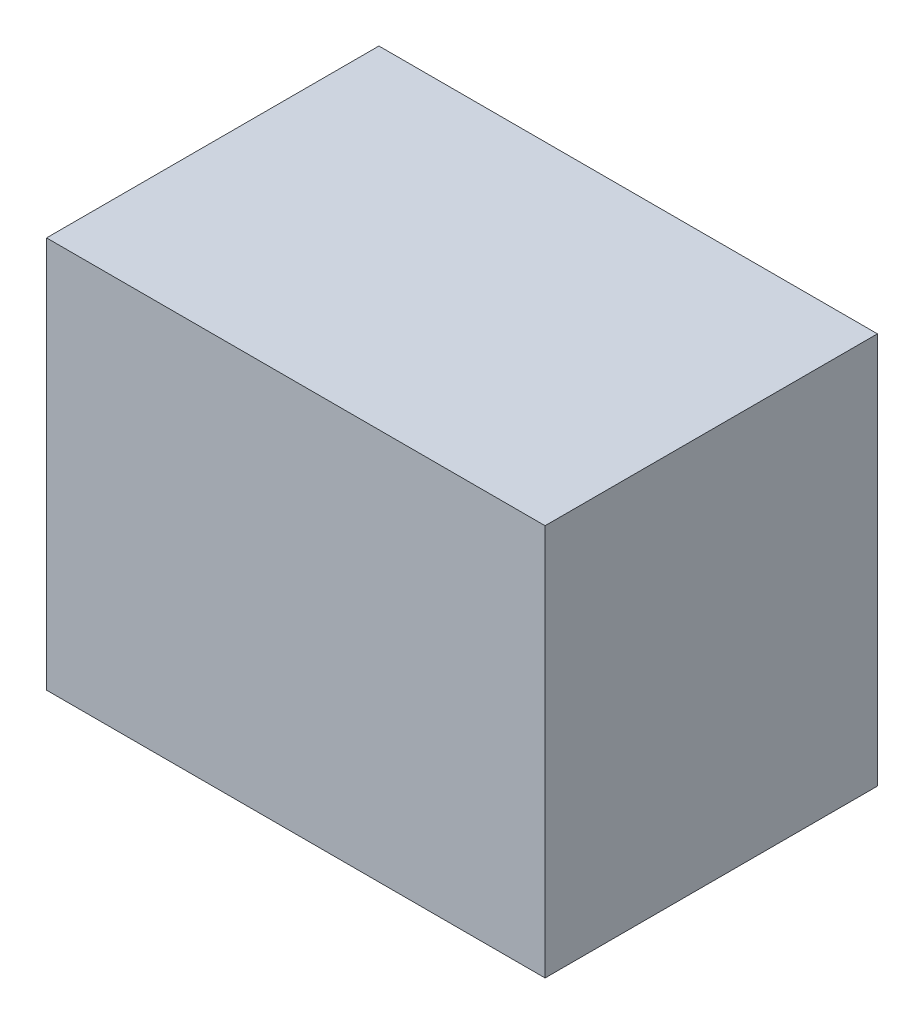
ISO-10303-21;
HEADER;
FILE_DESCRIPTION(('STEP AP214'),'2;1');
FILE_NAME('part.step','',(''),(''),'','','');
FILE_SCHEMA(('AUTOMOTIVE_DESIGN { 1 0 10303 214 1 1 1 1 }'));
ENDSEC;
DATA;
#1=APPLICATION_CONTEXT('core data for automotive mechanical design processes');
#2=APPLICATION_PROTOCOL_DEFINITION('international standard','automotive_design',2000,#1);
#3=PRODUCT_CONTEXT('',#1,'mechanical');
#4=PRODUCT('Part','Part','',(#3));
#5=PRODUCT_RELATED_PRODUCT_CATEGORY('part','',(#4));
#6=PRODUCT_DEFINITION_FORMATION('','',#4);
#7=PRODUCT_DEFINITION_CONTEXT('part definition',#1,'design');
#8=PRODUCT_DEFINITION('design','',#6,#7);
#9=PRODUCT_DEFINITION_SHAPE('','',#8);
#10=(LENGTH_UNIT() NAMED_UNIT(*) SI_UNIT(.MILLI.,.METRE.));
#11=(NAMED_UNIT(*) PLANE_ANGLE_UNIT() SI_UNIT($,.RADIAN.));
#12=(NAMED_UNIT(*) SI_UNIT($,.STERADIAN.) SOLID_ANGLE_UNIT());
#13=UNCERTAINTY_MEASURE_WITH_UNIT(LENGTH_MEASURE(1.E-05),#10,'distance_accuracy_value','');
#14=(GEOMETRIC_REPRESENTATION_CONTEXT(3) GLOBAL_UNCERTAINTY_ASSIGNED_CONTEXT((#13)) GLOBAL_UNIT_ASSIGNED_CONTEXT((#10,
#11,#12)) REPRESENTATION_CONTEXT('',''));
#15=CARTESIAN_POINT('',(0.,0.,0.));
#16=DIRECTION('',(0.,0.,1.));
#17=DIRECTION('',(1.,0.,0.));
#18=AXIS2_PLACEMENT_3D('',#15,#16,#17);
#19=CARTESIAN_POINT('',(2.10000088,1.65000178,2.8));
#20=DIRECTION('',(0.,0.,-1.));
#21=DIRECTION('',(-1.,0.,0.));
#22=AXIS2_PLACEMENT_3D('',#19,#20,#21);
#23=PLANE('',#22);
#24=DIRECTION('',(0.,1.,0.));
#25=VECTOR('',#24,1.);
#26=CARTESIAN_POINT('',(-2.10000088,1.65000178,2.8));
#27=LINE('',#26,#25);
#28=CARTESIAN_POINT('',(-2.10000088,1.65000178,2.8));
#29=VERTEX_POINT('',#28);
#30=CARTESIAN_POINT('',(-2.10000088,-1.64999924,2.8));
#31=VERTEX_POINT('',#30);
#32=EDGE_CURVE('E79',#29,#31,#27,.F.);
#33=ORIENTED_EDGE('',*,*,#32,.T.);
#34=DIRECTION('',(1.,0.,0.));
#35=VECTOR('',#34,1.);
#36=CARTESIAN_POINT('',(-2.10000088,-1.64999924,2.8));
#37=LINE('',#36,#35);
#38=CARTESIAN_POINT('',(2.10000088,-1.64999924,2.8));
#39=VERTEX_POINT('',#38);
#40=EDGE_CURVE('E55',#31,#39,#37,.T.);
#41=ORIENTED_EDGE('',*,*,#40,.T.);
#42=DIRECTION('',(0.,1.,0.));
#43=VECTOR('',#42,1.);
#44=CARTESIAN_POINT('',(2.10000088,-1.64999924,2.8));
#45=LINE('',#44,#43);
#46=CARTESIAN_POINT('',(2.10000088,1.65000178,2.8));
#47=VERTEX_POINT('',#46);
#48=EDGE_CURVE('E57',#39,#47,#45,.T.);
#49=ORIENTED_EDGE('',*,*,#48,.T.);
#50=DIRECTION('',(1.,0.,0.));
#51=VECTOR('',#50,1.);
#52=CARTESIAN_POINT('',(2.10000088,1.65000178,2.8));
#53=LINE('',#52,#51);
#54=EDGE_CURVE('E20',#47,#29,#53,.F.);
#55=ORIENTED_EDGE('',*,*,#54,.T.);
#56=EDGE_LOOP('',(#33,#41,#49,#55));
#57=FACE_BOUND('',#56,.T.);
#58=ADVANCED_FACE('F17',(#57),#23,.F.);
#59=CARTESIAN_POINT('',(2.10000088,1.65000178,0.));
#60=DIRECTION('',(0.,-1.,0.));
#61=DIRECTION('',(0.,0.,-1.));
#62=AXIS2_PLACEMENT_3D('',#59,#60,#61);
#63=PLANE('',#62);
#64=DIRECTION('',(-1.,0.,0.));
#65=VECTOR('',#64,1.);
#66=CARTESIAN_POINT('',(2.10000088,1.65000178,0.));
#67=LINE('',#66,#65);
#68=CARTESIAN_POINT('',(-2.10000088,1.65000178,0.));
#69=VERTEX_POINT('',#68);
#70=CARTESIAN_POINT('',(2.10000088,1.65000178,0.));
#71=VERTEX_POINT('',#70);
#72=EDGE_CURVE('E83',#69,#71,#67,.F.);
#73=ORIENTED_EDGE('',*,*,#72,.F.);
#74=DIRECTION('',(0.,0.,-1.));
#75=VECTOR('',#74,1.);
#76=CARTESIAN_POINT('',(-2.10000088,1.65000178,0.));
#77=LINE('',#76,#75);
#78=EDGE_CURVE('E68',#69,#29,#77,.F.);
#79=ORIENTED_EDGE('',*,*,#78,.T.);
#80=ORIENTED_EDGE('',*,*,#54,.F.);
#81=DIRECTION('',(0.,0.,1.));
#82=VECTOR('',#81,1.);
#83=CARTESIAN_POINT('',(2.10000088,1.65000178,0.));
#84=LINE('',#83,#82);
#85=EDGE_CURVE('E63',#47,#71,#84,.F.);
#86=ORIENTED_EDGE('',*,*,#85,.T.);
#87=EDGE_LOOP('',(#73,#79,#80,#86));
#88=FACE_BOUND('',#87,.T.);
#89=ADVANCED_FACE('F65',(#88),#63,.F.);
#90=CARTESIAN_POINT('',(2.10000088,-1.64999924,0.));
#91=DIRECTION('',(-1.,0.,0.));
#92=DIRECTION('',(0.,0.,1.));
#93=AXIS2_PLACEMENT_3D('',#90,#91,#92);
#94=PLANE('',#93);
#95=DIRECTION('',(0.,1.,0.));
#96=VECTOR('',#95,1.);
#97=CARTESIAN_POINT('',(2.10000088,1.65000178,0.));
#98=LINE('',#97,#96);
#99=CARTESIAN_POINT('',(2.10000088,-1.64999924,0.));
#100=VERTEX_POINT('',#99);
#101=EDGE_CURVE('E72',#71,#100,#98,.F.);
#102=ORIENTED_EDGE('',*,*,#101,.F.);
#103=ORIENTED_EDGE('',*,*,#85,.F.);
#104=ORIENTED_EDGE('',*,*,#48,.F.);
#105=DIRECTION('',(0.,0.,1.));
#106=VECTOR('',#105,1.);
#107=CARTESIAN_POINT('',(2.10000088,-1.64999924,0.));
#108=LINE('',#107,#106);
#109=EDGE_CURVE('E75',#39,#100,#108,.F.);
#110=ORIENTED_EDGE('',*,*,#109,.T.);
#111=EDGE_LOOP('',(#102,#103,#104,#110));
#112=FACE_BOUND('',#111,.T.);
#113=ADVANCED_FACE('F70',(#112),#94,.F.);
#114=CARTESIAN_POINT('',(-2.10000088,-1.64999924,0.));
#115=DIRECTION('',(0.,1.,0.));
#116=DIRECTION('',(0.,0.,1.));
#117=AXIS2_PLACEMENT_3D('',#114,#115,#116);
#118=PLANE('',#117);
#119=DIRECTION('',(-1.,0.,0.));
#120=VECTOR('',#119,1.);
#121=CARTESIAN_POINT('',(2.10000088,-1.64999924,0.));
#122=LINE('',#121,#120);
#123=CARTESIAN_POINT('',(-2.10000088,-1.64999924,0.));
#124=VERTEX_POINT('',#123);
#125=EDGE_CURVE('E26',#100,#124,#122,.T.);
#126=ORIENTED_EDGE('',*,*,#125,.F.);
#127=ORIENTED_EDGE('',*,*,#109,.F.);
#128=ORIENTED_EDGE('',*,*,#40,.F.);
#129=DIRECTION('',(0.,0.,-1.));
#130=VECTOR('',#129,1.);
#131=CARTESIAN_POINT('',(-2.10000088,-1.64999924,0.));
#132=LINE('',#131,#130);
#133=EDGE_CURVE('E35',#31,#124,#132,.T.);
#134=ORIENTED_EDGE('',*,*,#133,.T.);
#135=EDGE_LOOP('',(#126,#127,#128,#134));
#136=FACE_BOUND('',#135,.T.);
#137=ADVANCED_FACE('F89',(#136),#118,.F.);
#138=CARTESIAN_POINT('',(-2.10000088,1.65000178,0.));
#139=DIRECTION('',(1.,0.,0.));
#140=DIRECTION('',(0.,0.,-1.));
#141=AXIS2_PLACEMENT_3D('',#138,#139,#140);
#142=PLANE('',#141);
#143=DIRECTION('',(0.,1.,0.));
#144=VECTOR('',#143,1.);
#145=CARTESIAN_POINT('',(-2.10000088,1.65000178,0.));
#146=LINE('',#145,#144);
#147=EDGE_CURVE('E11',#124,#69,#146,.T.);
#148=ORIENTED_EDGE('',*,*,#147,.F.);
#149=ORIENTED_EDGE('',*,*,#133,.F.);
#150=ORIENTED_EDGE('',*,*,#32,.F.);
#151=ORIENTED_EDGE('',*,*,#78,.F.);
#152=EDGE_LOOP('',(#148,#149,#150,#151));
#153=FACE_BOUND('',#152,.T.);
#154=ADVANCED_FACE('F91',(#153),#142,.F.);
#155=CARTESIAN_POINT('',(2.10000088,1.65000178,0.));
#156=DIRECTION('',(0.,0.,-1.));
#157=DIRECTION('',(-1.,0.,0.));
#158=AXIS2_PLACEMENT_3D('',#155,#156,#157);
#159=PLANE('',#158);
#160=ORIENTED_EDGE('',*,*,#125,.T.);
#161=ORIENTED_EDGE('',*,*,#147,.T.);
#162=ORIENTED_EDGE('',*,*,#72,.T.);
#163=ORIENTED_EDGE('',*,*,#101,.T.);
#164=EDGE_LOOP('',(#160,#161,#162,#163));
#165=FACE_BOUND('',#164,.T.);
#166=ADVANCED_FACE('F88',(#165),#159,.T.);
#167=CLOSED_SHELL('',(#58,#89,#113,#137,#154,#166));
#168=MANIFOLD_SOLID_BREP('B1',#167);
#169=ADVANCED_BREP_SHAPE_REPRESENTATION('',(#18,#168),#14);
#170=SHAPE_DEFINITION_REPRESENTATION(#9,#169);
ENDSEC;
END-ISO-10303-21;
